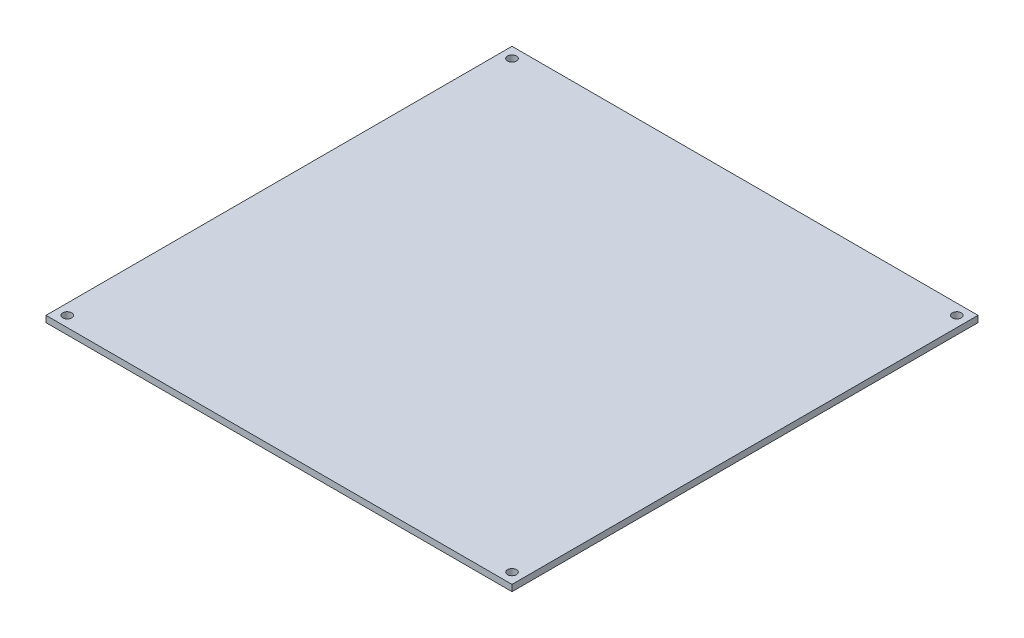
ISO-10303-21;
HEADER;
FILE_DESCRIPTION(('STEP AP214'),'2;1');
FILE_NAME('part.step','',(''),(''),'','','');
FILE_SCHEMA(('AUTOMOTIVE_DESIGN { 1 0 10303 214 1 1 1 1 }'));
ENDSEC;
DATA;
#1=APPLICATION_CONTEXT('core data for automotive mechanical design processes');
#2=APPLICATION_PROTOCOL_DEFINITION('international standard','automotive_design',2000,#1);
#3=PRODUCT_CONTEXT('',#1,'mechanical');
#4=PRODUCT('Part','Part','',(#3));
#5=PRODUCT_RELATED_PRODUCT_CATEGORY('part','',(#4));
#6=PRODUCT_DEFINITION_FORMATION('','',#4);
#7=PRODUCT_DEFINITION_CONTEXT('part definition',#1,'design');
#8=PRODUCT_DEFINITION('design','',#6,#7);
#9=PRODUCT_DEFINITION_SHAPE('','',#8);
#10=(LENGTH_UNIT() NAMED_UNIT(*) SI_UNIT(.MILLI.,.METRE.));
#11=(NAMED_UNIT(*) PLANE_ANGLE_UNIT() SI_UNIT($,.RADIAN.));
#12=(NAMED_UNIT(*) SI_UNIT($,.STERADIAN.) SOLID_ANGLE_UNIT());
#13=UNCERTAINTY_MEASURE_WITH_UNIT(LENGTH_MEASURE(1.E-05),#10,'distance_accuracy_value','');
#14=(GEOMETRIC_REPRESENTATION_CONTEXT(3) GLOBAL_UNCERTAINTY_ASSIGNED_CONTEXT((#13)) GLOBAL_UNIT_ASSIGNED_CONTEXT((#10,
#11,#12)) REPRESENTATION_CONTEXT('',''));
#15=CARTESIAN_POINT('',(0.,0.,0.));
#16=DIRECTION('',(0.,0.,1.));
#17=DIRECTION('',(1.,0.,0.));
#18=AXIS2_PLACEMENT_3D('',#15,#16,#17);
#19=CARTESIAN_POINT('',(0.,3.,0.));
#20=DIRECTION('',(0.,-1.,0.));
#21=DIRECTION('',(0.,0.,-1.));
#22=AXIS2_PLACEMENT_3D('',#19,#20,#21);
#23=PLANE('',#22);
#24=DIRECTION('',(0.,0.,-1.));
#25=VECTOR('',#24,1.);
#26=CARTESIAN_POINT('',(110.,3.,110.));
#27=LINE('',#26,#25);
#28=CARTESIAN_POINT('',(110.,3.,110.));
#29=VERTEX_POINT('',#28);
#30=CARTESIAN_POINT('',(110.,3.,-110.));
#31=VERTEX_POINT('',#30);
#32=EDGE_CURVE('E84',#29,#31,#27,.T.);
#33=ORIENTED_EDGE('',*,*,#32,.T.);
#34=DIRECTION('',(-1.,0.,0.));
#35=VECTOR('',#34,1.);
#36=CARTESIAN_POINT('',(-110.,3.,-110.));
#37=LINE('',#36,#35);
#38=CARTESIAN_POINT('',(-110.,3.,-110.));
#39=VERTEX_POINT('',#38);
#40=EDGE_CURVE('E79',#31,#39,#37,.T.);
#41=ORIENTED_EDGE('',*,*,#40,.T.);
#42=DIRECTION('',(0.,0.,1.));
#43=VECTOR('',#42,1.);
#44=CARTESIAN_POINT('',(-110.,3.,110.));
#45=LINE('',#44,#43);
#46=CARTESIAN_POINT('',(-110.,3.,110.));
#47=VERTEX_POINT('',#46);
#48=EDGE_CURVE('E82',#39,#47,#45,.T.);
#49=ORIENTED_EDGE('',*,*,#48,.T.);
#50=DIRECTION('',(1.,0.,0.));
#51=VECTOR('',#50,1.);
#52=CARTESIAN_POINT('',(-110.,3.,110.));
#53=LINE('',#52,#51);
#54=EDGE_CURVE('E49',#47,#29,#53,.T.);
#55=ORIENTED_EDGE('',*,*,#54,.T.);
#56=EDGE_LOOP('',(#33,#41,#49,#55));
#57=FACE_BOUND('',#56,.T.);
#58=CARTESIAN_POINT('',(-105.,3.,-105.));
#59=DIRECTION('',(0.,1.,0.));
#60=DIRECTION('',(0.,0.,1.));
#61=AXIS2_PLACEMENT_3D('',#58,#59,#60);
#62=CIRCLE('',#61,2.1000257471874);
#63=CARTESIAN_POINT('',(-105.,3.,-102.899974252813));
#64=VERTEX_POINT('',#63);
#65=EDGE_CURVE('E99',#64,#64,#62,.T.);
#66=ORIENTED_EDGE('',*,*,#65,.F.);
#67=EDGE_LOOP('',(#66));
#68=FACE_BOUND('',#67,.T.);
#69=CARTESIAN_POINT('',(105.,3.,-105.));
#70=DIRECTION('',(0.,1.,0.));
#71=DIRECTION('',(0.,0.,1.));
#72=AXIS2_PLACEMENT_3D('',#69,#70,#71);
#73=CIRCLE('',#72,2.1000257471874);
#74=CARTESIAN_POINT('',(105.,3.,-102.899974252813));
#75=VERTEX_POINT('',#74);
#76=EDGE_CURVE('E114',#75,#75,#73,.T.);
#77=ORIENTED_EDGE('',*,*,#76,.F.);
#78=EDGE_LOOP('',(#77));
#79=FACE_BOUND('',#78,.T.);
#80=CARTESIAN_POINT('',(105.000000000002,3.,105.));
#81=DIRECTION('',(0.,1.,0.));
#82=DIRECTION('',(0.,0.,1.));
#83=AXIS2_PLACEMENT_3D('',#80,#81,#82);
#84=CIRCLE('',#83,2.1000257471874);
#85=CARTESIAN_POINT('',(105.000000000002,3.,107.100025747187));
#86=VERTEX_POINT('',#85);
#87=EDGE_CURVE('E120',#86,#86,#84,.T.);
#88=ORIENTED_EDGE('',*,*,#87,.F.);
#89=EDGE_LOOP('',(#88));
#90=FACE_BOUND('',#89,.T.);
#91=CARTESIAN_POINT('',(-104.999999999998,3.,105.));
#92=DIRECTION('',(0.,1.,0.));
#93=DIRECTION('',(0.,0.,1.));
#94=AXIS2_PLACEMENT_3D('',#91,#92,#93);
#95=CIRCLE('',#94,2.1000257471874);
#96=CARTESIAN_POINT('',(-104.999999999998,3.,107.100025747187));
#97=VERTEX_POINT('',#96);
#98=EDGE_CURVE('E126',#97,#97,#95,.T.);
#99=ORIENTED_EDGE('',*,*,#98,.F.);
#100=EDGE_LOOP('',(#99));
#101=FACE_BOUND('',#100,.T.);
#102=ADVANCED_FACE('F32',(#57,#68,#79,#90,#101),#23,.F.);
#103=CARTESIAN_POINT('',(0.,0.,0.));
#104=DIRECTION('',(0.,-1.,0.));
#105=DIRECTION('',(0.,0.,-1.));
#106=AXIS2_PLACEMENT_3D('',#103,#104,#105);
#107=PLANE('',#106);
#108=CARTESIAN_POINT('',(105.000000000002,0.,105.));
#109=DIRECTION('',(0.,1.,0.));
#110=DIRECTION('',(0.,0.,1.));
#111=AXIS2_PLACEMENT_3D('',#108,#109,#110);
#112=CIRCLE('',#111,2.1000257471874);
#113=CARTESIAN_POINT('',(105.000000000002,0.,107.100025747187));
#114=VERTEX_POINT('',#113);
#115=EDGE_CURVE('E123',#114,#114,#112,.T.);
#116=ORIENTED_EDGE('',*,*,#115,.T.);
#117=EDGE_LOOP('',(#116));
#118=FACE_BOUND('',#117,.T.);
#119=CARTESIAN_POINT('',(-105.,0.,-105.));
#120=DIRECTION('',(0.,1.,0.));
#121=DIRECTION('',(0.,0.,1.));
#122=AXIS2_PLACEMENT_3D('',#119,#120,#121);
#123=CIRCLE('',#122,2.1000257471874);
#124=CARTESIAN_POINT('',(-105.,0.,-102.899974252813));
#125=VERTEX_POINT('',#124);
#126=EDGE_CURVE('E111',#125,#125,#123,.T.);
#127=ORIENTED_EDGE('',*,*,#126,.T.);
#128=EDGE_LOOP('',(#127));
#129=FACE_BOUND('',#128,.T.);
#130=DIRECTION('',(0.,0.,-1.));
#131=VECTOR('',#130,1.);
#132=CARTESIAN_POINT('',(110.,0.,110.));
#133=LINE('',#132,#131);
#134=CARTESIAN_POINT('',(110.,0.,110.));
#135=VERTEX_POINT('',#134);
#136=CARTESIAN_POINT('',(110.,0.,-110.));
#137=VERTEX_POINT('',#136);
#138=EDGE_CURVE('E96',#135,#137,#133,.T.);
#139=ORIENTED_EDGE('',*,*,#138,.F.);
#140=DIRECTION('',(1.,0.,0.));
#141=VECTOR('',#140,1.);
#142=CARTESIAN_POINT('',(-110.,0.,110.));
#143=LINE('',#142,#141);
#144=CARTESIAN_POINT('',(-110.,0.,110.));
#145=VERTEX_POINT('',#144);
#146=EDGE_CURVE('E72',#145,#135,#143,.T.);
#147=ORIENTED_EDGE('',*,*,#146,.F.);
#148=DIRECTION('',(0.,0.,1.));
#149=VECTOR('',#148,1.);
#150=CARTESIAN_POINT('',(-110.,0.,110.));
#151=LINE('',#150,#149);
#152=CARTESIAN_POINT('',(-110.,0.,-110.));
#153=VERTEX_POINT('',#152);
#154=EDGE_CURVE('E66',#153,#145,#151,.T.);
#155=ORIENTED_EDGE('',*,*,#154,.F.);
#156=DIRECTION('',(-1.,0.,0.));
#157=VECTOR('',#156,1.);
#158=CARTESIAN_POINT('',(-110.,0.,-110.));
#159=LINE('',#158,#157);
#160=EDGE_CURVE('E88',#137,#153,#159,.T.);
#161=ORIENTED_EDGE('',*,*,#160,.F.);
#162=EDGE_LOOP('',(#139,#147,#155,#161));
#163=FACE_BOUND('',#162,.T.);
#164=CARTESIAN_POINT('',(105.,0.,-105.));
#165=DIRECTION('',(0.,1.,0.));
#166=DIRECTION('',(0.,0.,1.));
#167=AXIS2_PLACEMENT_3D('',#164,#165,#166);
#168=CIRCLE('',#167,2.1000257471874);
#169=CARTESIAN_POINT('',(105.,0.,-102.899974252813));
#170=VERTEX_POINT('',#169);
#171=EDGE_CURVE('E117',#170,#170,#168,.T.);
#172=ORIENTED_EDGE('',*,*,#171,.T.);
#173=EDGE_LOOP('',(#172));
#174=FACE_BOUND('',#173,.T.);
#175=CARTESIAN_POINT('',(-104.999999999998,0.,105.));
#176=DIRECTION('',(0.,1.,0.));
#177=DIRECTION('',(0.,0.,1.));
#178=AXIS2_PLACEMENT_3D('',#175,#176,#177);
#179=CIRCLE('',#178,2.1000257471874);
#180=CARTESIAN_POINT('',(-104.999999999998,0.,107.100025747187));
#181=VERTEX_POINT('',#180);
#182=EDGE_CURVE('E129',#181,#181,#179,.T.);
#183=ORIENTED_EDGE('',*,*,#182,.T.);
#184=EDGE_LOOP('',(#183));
#185=FACE_BOUND('',#184,.T.);
#186=ADVANCED_FACE('F107',(#118,#129,#163,#174,#185),#107,.T.);
#187=CARTESIAN_POINT('',(110.,3.,110.));
#188=DIRECTION('',(-1.,0.,0.));
#189=DIRECTION('',(0.,0.,1.));
#190=AXIS2_PLACEMENT_3D('',#187,#188,#189);
#191=PLANE('',#190);
#192=ORIENTED_EDGE('',*,*,#138,.T.);
#193=DIRECTION('',(0.,-1.,0.));
#194=VECTOR('',#193,1.);
#195=CARTESIAN_POINT('',(110.,3.,-110.));
#196=LINE('',#195,#194);
#197=EDGE_CURVE('E11',#31,#137,#196,.T.);
#198=ORIENTED_EDGE('',*,*,#197,.F.);
#199=ORIENTED_EDGE('',*,*,#32,.F.);
#200=DIRECTION('',(0.,-1.,0.));
#201=VECTOR('',#200,1.);
#202=CARTESIAN_POINT('',(110.,3.,110.));
#203=LINE('',#202,#201);
#204=EDGE_CURVE('E92',#29,#135,#203,.T.);
#205=ORIENTED_EDGE('',*,*,#204,.T.);
#206=EDGE_LOOP('',(#192,#198,#199,#205));
#207=FACE_BOUND('',#206,.T.);
#208=ADVANCED_FACE('F34',(#207),#191,.F.);
#209=CARTESIAN_POINT('',(-110.,3.,-110.));
#210=DIRECTION('',(0.,0.,1.));
#211=DIRECTION('',(1.,0.,0.));
#212=AXIS2_PLACEMENT_3D('',#209,#210,#211);
#213=PLANE('',#212);
#214=ORIENTED_EDGE('',*,*,#160,.T.);
#215=DIRECTION('',(0.,-1.,0.));
#216=VECTOR('',#215,1.);
#217=CARTESIAN_POINT('',(-110.,3.,-110.));
#218=LINE('',#217,#216);
#219=EDGE_CURVE('E41',#39,#153,#218,.T.);
#220=ORIENTED_EDGE('',*,*,#219,.F.);
#221=ORIENTED_EDGE('',*,*,#40,.F.);
#222=ORIENTED_EDGE('',*,*,#197,.T.);
#223=EDGE_LOOP('',(#214,#220,#221,#222));
#224=FACE_BOUND('',#223,.T.);
#225=ADVANCED_FACE('F87',(#224),#213,.F.);
#226=CARTESIAN_POINT('',(-110.,3.,110.));
#227=DIRECTION('',(1.,0.,0.));
#228=DIRECTION('',(0.,0.,-1.));
#229=AXIS2_PLACEMENT_3D('',#226,#227,#228);
#230=PLANE('',#229);
#231=ORIENTED_EDGE('',*,*,#154,.T.);
#232=DIRECTION('',(0.,-1.,0.));
#233=VECTOR('',#232,1.);
#234=CARTESIAN_POINT('',(-110.,3.,110.));
#235=LINE('',#234,#233);
#236=EDGE_CURVE('E89',#47,#145,#235,.T.);
#237=ORIENTED_EDGE('',*,*,#236,.F.);
#238=ORIENTED_EDGE('',*,*,#48,.F.);
#239=ORIENTED_EDGE('',*,*,#219,.T.);
#240=EDGE_LOOP('',(#231,#237,#238,#239));
#241=FACE_BOUND('',#240,.T.);
#242=ADVANCED_FACE('F90',(#241),#230,.F.);
#243=CARTESIAN_POINT('',(-110.,3.,110.));
#244=DIRECTION('',(0.,0.,-1.));
#245=DIRECTION('',(-1.,0.,0.));
#246=AXIS2_PLACEMENT_3D('',#243,#244,#245);
#247=PLANE('',#246);
#248=ORIENTED_EDGE('',*,*,#146,.T.);
#249=ORIENTED_EDGE('',*,*,#204,.F.);
#250=ORIENTED_EDGE('',*,*,#54,.F.);
#251=ORIENTED_EDGE('',*,*,#236,.T.);
#252=EDGE_LOOP('',(#248,#249,#250,#251));
#253=FACE_BOUND('',#252,.T.);
#254=ADVANCED_FACE('F104',(#253),#247,.F.);
#255=CARTESIAN_POINT('',(-105.,3.,-105.));
#256=DIRECTION('',(0.,-1.,0.));
#257=DIRECTION('',(0.,0.,-1.));
#258=AXIS2_PLACEMENT_3D('',#255,#256,#257);
#259=CYLINDRICAL_SURFACE('',#258,2.1000257471874);
#260=ORIENTED_EDGE('',*,*,#65,.T.);
#261=EDGE_LOOP('',(#260));
#262=FACE_BOUND('',#261,.T.);
#263=ORIENTED_EDGE('',*,*,#126,.F.);
#264=EDGE_LOOP('',(#263));
#265=FACE_BOUND('',#264,.T.);
#266=ADVANCED_FACE('F146',(#262,#265),#259,.F.);
#267=CARTESIAN_POINT('',(105.,3.,-105.));
#268=DIRECTION('',(0.,-1.,0.));
#269=DIRECTION('',(0.,0.,-1.));
#270=AXIS2_PLACEMENT_3D('',#267,#268,#269);
#271=CYLINDRICAL_SURFACE('',#270,2.1000257471874);
#272=ORIENTED_EDGE('',*,*,#76,.T.);
#273=EDGE_LOOP('',(#272));
#274=FACE_BOUND('',#273,.T.);
#275=ORIENTED_EDGE('',*,*,#171,.F.);
#276=EDGE_LOOP('',(#275));
#277=FACE_BOUND('',#276,.T.);
#278=ADVANCED_FACE('F192',(#274,#277),#271,.F.);
#279=CARTESIAN_POINT('',(105.000000000002,3.,105.));
#280=DIRECTION('',(0.,-1.,0.));
#281=DIRECTION('',(0.,0.,-1.));
#282=AXIS2_PLACEMENT_3D('',#279,#280,#281);
#283=CYLINDRICAL_SURFACE('',#282,2.1000257471874);
#284=ORIENTED_EDGE('',*,*,#87,.T.);
#285=EDGE_LOOP('',(#284));
#286=FACE_BOUND('',#285,.T.);
#287=ORIENTED_EDGE('',*,*,#115,.F.);
#288=EDGE_LOOP('',(#287));
#289=FACE_BOUND('',#288,.T.);
#290=ADVANCED_FACE('F200',(#286,#289),#283,.F.);
#291=CARTESIAN_POINT('',(-104.999999999998,3.,105.));
#292=DIRECTION('',(0.,-1.,0.));
#293=DIRECTION('',(0.,0.,-1.));
#294=AXIS2_PLACEMENT_3D('',#291,#292,#293);
#295=CYLINDRICAL_SURFACE('',#294,2.1000257471874);
#296=ORIENTED_EDGE('',*,*,#98,.T.);
#297=EDGE_LOOP('',(#296));
#298=FACE_BOUND('',#297,.T.);
#299=ORIENTED_EDGE('',*,*,#182,.F.);
#300=EDGE_LOOP('',(#299));
#301=FACE_BOUND('',#300,.T.);
#302=ADVANCED_FACE('F135',(#298,#301),#295,.F.);
#303=CLOSED_SHELL('',(#102,#186,#208,#225,#242,#254,#266,#278,#290,#302));
#304=MANIFOLD_SOLID_BREP('B2',#303);
#305=ADVANCED_BREP_SHAPE_REPRESENTATION('',(#18,#304),#14);
#306=SHAPE_DEFINITION_REPRESENTATION(#9,#305);
ENDSEC;
END-ISO-10303-21;
